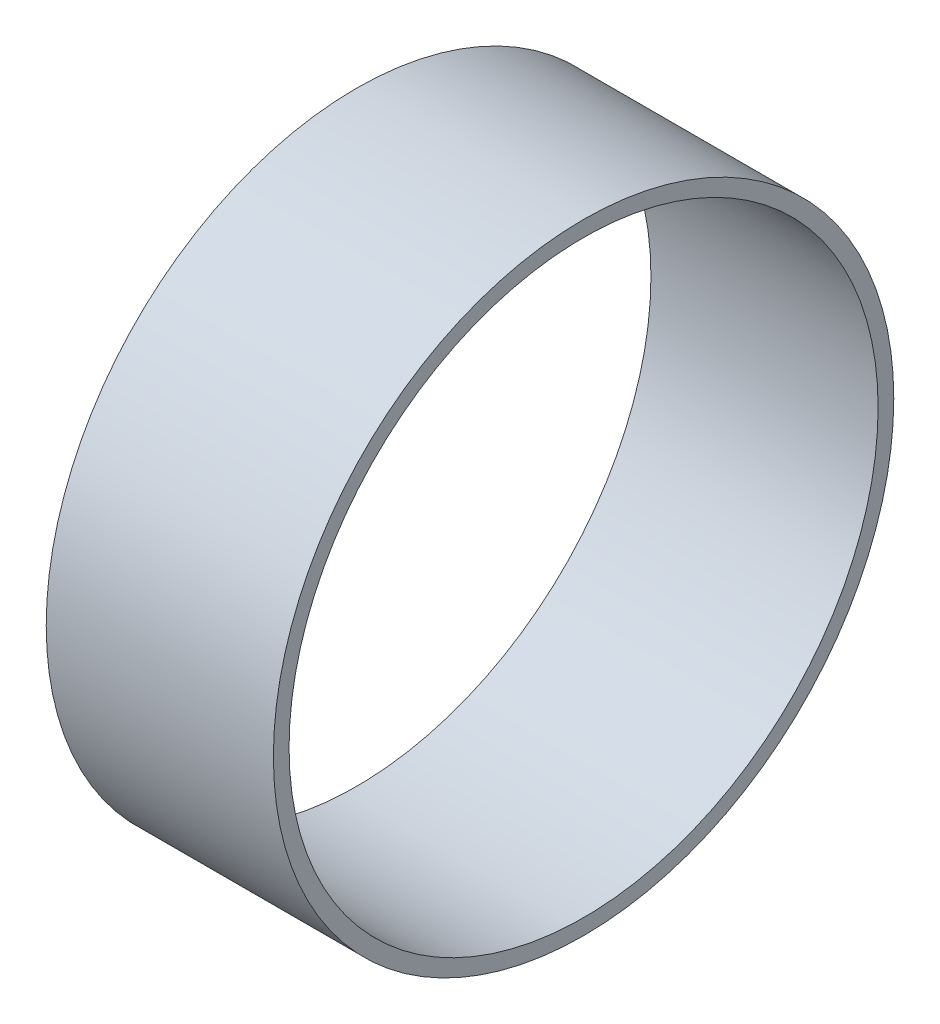
ISO-10303-21;
HEADER;
FILE_DESCRIPTION(('STEP AP214'),'2;1');
FILE_NAME('part.step','',(''),(''),'','','');
FILE_SCHEMA(('AUTOMOTIVE_DESIGN { 1 0 10303 214 1 1 1 1 }'));
ENDSEC;
DATA;
#1=APPLICATION_CONTEXT('core data for automotive mechanical design processes');
#2=APPLICATION_PROTOCOL_DEFINITION('international standard','automotive_design',2000,#1);
#3=PRODUCT_CONTEXT('',#1,'mechanical');
#4=PRODUCT('Part','Part','',(#3));
#5=PRODUCT_RELATED_PRODUCT_CATEGORY('part','',(#4));
#6=PRODUCT_DEFINITION_FORMATION('','',#4);
#7=PRODUCT_DEFINITION_CONTEXT('part definition',#1,'design');
#8=PRODUCT_DEFINITION('design','',#6,#7);
#9=PRODUCT_DEFINITION_SHAPE('','',#8);
#10=(LENGTH_UNIT() NAMED_UNIT(*) SI_UNIT(.MILLI.,.METRE.));
#11=(NAMED_UNIT(*) PLANE_ANGLE_UNIT() SI_UNIT($,.RADIAN.));
#12=(NAMED_UNIT(*) SI_UNIT($,.STERADIAN.) SOLID_ANGLE_UNIT());
#13=UNCERTAINTY_MEASURE_WITH_UNIT(LENGTH_MEASURE(1.E-05),#10,'distance_accuracy_value','');
#14=(GEOMETRIC_REPRESENTATION_CONTEXT(3) GLOBAL_UNCERTAINTY_ASSIGNED_CONTEXT((#13)) GLOBAL_UNIT_ASSIGNED_CONTEXT((#10,
#11,#12)) REPRESENTATION_CONTEXT('',''));
#15=CARTESIAN_POINT('',(0.,0.,0.));
#16=DIRECTION('',(0.,0.,1.));
#17=DIRECTION('',(1.,0.,0.));
#18=AXIS2_PLACEMENT_3D('',#15,#16,#17);
#19=CARTESIAN_POINT('',(0.,0.,0.));
#20=DIRECTION('',(-1.,0.,0.));
#21=DIRECTION('',(0.,0.,1.));
#22=AXIS2_PLACEMENT_3D('',#19,#20,#21);
#23=CYLINDRICAL_SURFACE('',#22,19.8);
#24=CARTESIAN_POINT('',(29.5,0.,0.));
#25=DIRECTION('',(-1.,0.,0.));
#26=DIRECTION('',(0.,0.,1.));
#27=AXIS2_PLACEMENT_3D('',#24,#25,#26);
#28=CIRCLE('',#27,19.8);
#29=CARTESIAN_POINT('',(29.5,0.,19.8));
#30=VERTEX_POINT('',#29);
#31=EDGE_CURVE('E43',#30,#30,#28,.T.);
#32=ORIENTED_EDGE('',*,*,#31,.T.);
#33=EDGE_LOOP('',(#32));
#34=FACE_BOUND('',#33,.T.);
#35=CARTESIAN_POINT('',(15.,0.,0.));
#36=DIRECTION('',(-1.,0.,0.));
#37=DIRECTION('',(0.,0.,1.));
#38=AXIS2_PLACEMENT_3D('',#35,#36,#37);
#39=CIRCLE('',#38,19.8);
#40=CARTESIAN_POINT('',(15.,0.,19.8));
#41=VERTEX_POINT('',#40);
#42=EDGE_CURVE('E10',#41,#41,#39,.T.);
#43=ORIENTED_EDGE('',*,*,#42,.F.);
#44=EDGE_LOOP('',(#43));
#45=FACE_BOUND('',#44,.T.);
#46=ADVANCED_FACE('F29',(#34,#45),#23,.T.);
#47=CARTESIAN_POINT('',(15.,-19.8,0.));
#48=DIRECTION('',(1.,0.,0.));
#49=DIRECTION('',(0.,0.,-1.));
#50=AXIS2_PLACEMENT_3D('',#47,#48,#49);
#51=PLANE('',#50);
#52=CARTESIAN_POINT('',(15.,0.,0.));
#53=DIRECTION('',(-1.,0.,0.));
#54=DIRECTION('',(0.,0.,1.));
#55=AXIS2_PLACEMENT_3D('',#52,#53,#54);
#56=CIRCLE('',#55,18.8);
#57=CARTESIAN_POINT('',(15.,0.,18.8));
#58=VERTEX_POINT('',#57);
#59=EDGE_CURVE('E35',#58,#58,#56,.T.);
#60=ORIENTED_EDGE('',*,*,#59,.F.);
#61=EDGE_LOOP('',(#60));
#62=FACE_BOUND('',#61,.T.);
#63=ORIENTED_EDGE('',*,*,#42,.T.);
#64=EDGE_LOOP('',(#63));
#65=FACE_BOUND('',#64,.T.);
#66=ADVANCED_FACE('F59',(#62,#65),#51,.F.);
#67=CARTESIAN_POINT('',(0.,0.,0.));
#68=DIRECTION('',(-1.,0.,0.));
#69=DIRECTION('',(0.,0.,1.));
#70=AXIS2_PLACEMENT_3D('',#67,#68,#69);
#71=CYLINDRICAL_SURFACE('',#70,18.8);
#72=CARTESIAN_POINT('',(29.5,0.,0.));
#73=DIRECTION('',(-1.,0.,0.));
#74=DIRECTION('',(0.,0.,1.));
#75=AXIS2_PLACEMENT_3D('',#72,#73,#74);
#76=CIRCLE('',#75,18.8);
#77=CARTESIAN_POINT('',(29.5,0.,18.8));
#78=VERTEX_POINT('',#77);
#79=EDGE_CURVE('E39',#78,#78,#76,.T.);
#80=ORIENTED_EDGE('',*,*,#79,.F.);
#81=EDGE_LOOP('',(#80));
#82=FACE_BOUND('',#81,.T.);
#83=ORIENTED_EDGE('',*,*,#59,.T.);
#84=EDGE_LOOP('',(#83));
#85=FACE_BOUND('',#84,.T.);
#86=ADVANCED_FACE('F54',(#82,#85),#71,.F.);
#87=CARTESIAN_POINT('',(29.5,-18.8,0.));
#88=DIRECTION('',(-1.,0.,0.));
#89=DIRECTION('',(0.,0.,1.));
#90=AXIS2_PLACEMENT_3D('',#87,#88,#89);
#91=PLANE('',#90);
#92=ORIENTED_EDGE('',*,*,#31,.F.);
#93=EDGE_LOOP('',(#92));
#94=FACE_BOUND('',#93,.T.);
#95=ORIENTED_EDGE('',*,*,#79,.T.);
#96=EDGE_LOOP('',(#95));
#97=FACE_BOUND('',#96,.T.);
#98=ADVANCED_FACE('F51',(#94,#97),#91,.F.);
#99=CLOSED_SHELL('',(#46,#66,#86,#98));
#100=MANIFOLD_SOLID_BREP('B2',#99);
#101=ADVANCED_BREP_SHAPE_REPRESENTATION('',(#18,#100),#14);
#102=SHAPE_DEFINITION_REPRESENTATION(#9,#101);
ENDSEC;
END-ISO-10303-21;
